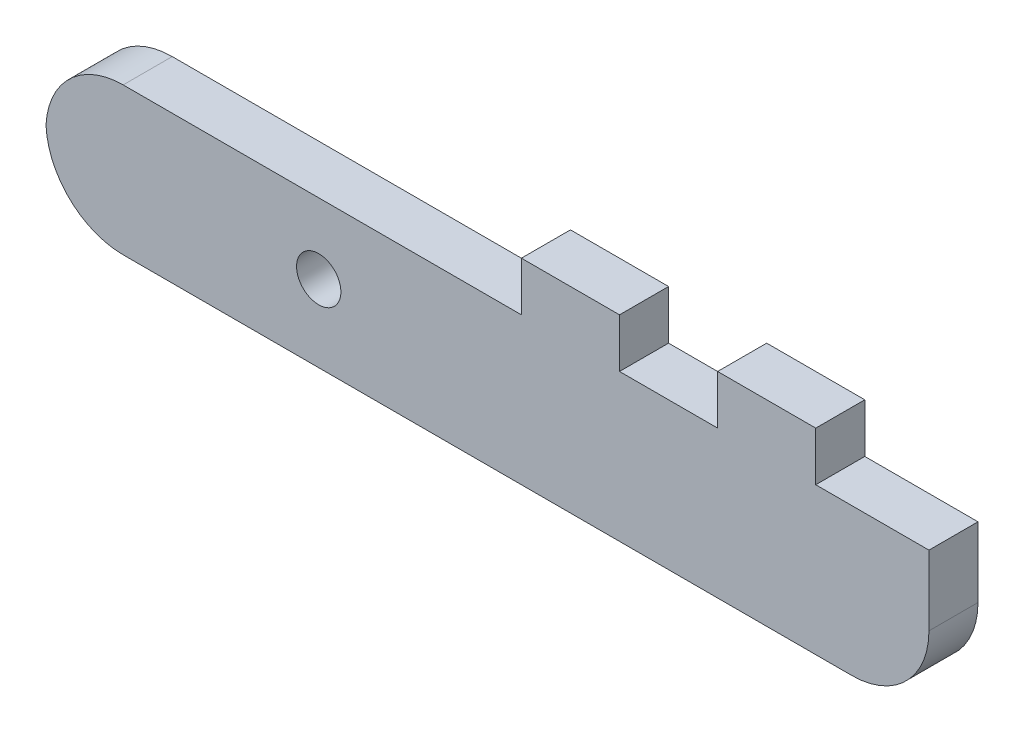
ISO-10303-21;
HEADER;
FILE_DESCRIPTION(('STEP AP214'),'2;1');
FILE_NAME('part.step','',(''),(''),'','','');
FILE_SCHEMA(('AUTOMOTIVE_DESIGN { 1 0 10303 214 1 1 1 1 }'));
ENDSEC;
DATA;
#1=APPLICATION_CONTEXT('core data for automotive mechanical design processes');
#2=APPLICATION_PROTOCOL_DEFINITION('international standard','automotive_design',2000,#1);
#3=PRODUCT_CONTEXT('',#1,'mechanical');
#4=PRODUCT('Part','Part','',(#3));
#5=PRODUCT_RELATED_PRODUCT_CATEGORY('part','',(#4));
#6=PRODUCT_DEFINITION_FORMATION('','',#4);
#7=PRODUCT_DEFINITION_CONTEXT('part definition',#1,'design');
#8=PRODUCT_DEFINITION('design','',#6,#7);
#9=PRODUCT_DEFINITION_SHAPE('','',#8);
#10=(LENGTH_UNIT() NAMED_UNIT(*) SI_UNIT(.MILLI.,.METRE.));
#11=(NAMED_UNIT(*) PLANE_ANGLE_UNIT() SI_UNIT($,.RADIAN.));
#12=(NAMED_UNIT(*) SI_UNIT($,.STERADIAN.) SOLID_ANGLE_UNIT());
#13=UNCERTAINTY_MEASURE_WITH_UNIT(LENGTH_MEASURE(1.E-05),#10,'distance_accuracy_value','');
#14=(GEOMETRIC_REPRESENTATION_CONTEXT(3) GLOBAL_UNCERTAINTY_ASSIGNED_CONTEXT((#13)) GLOBAL_UNIT_ASSIGNED_CONTEXT((#10,
#11,#12)) REPRESENTATION_CONTEXT('',''));
#15=CARTESIAN_POINT('',(0.,0.,0.));
#16=DIRECTION('',(0.,0.,1.));
#17=DIRECTION('',(1.,0.,0.));
#18=AXIS2_PLACEMENT_3D('',#15,#16,#17);
#19=CARTESIAN_POINT('',(26.2355652314434,15.4750000000003,6.35));
#20=DIRECTION('',(1.,0.,0.));
#21=DIRECTION('',(0.,0.,-1.));
#22=AXIS2_PLACEMENT_3D('',#19,#20,#21);
#23=PLANE('',#22);
#24=DIRECTION('',(0.,-1.,0.));
#25=VECTOR('',#24,1.);
#26=CARTESIAN_POINT('',(26.2355652314434,15.4750000000003,0.));
#27=LINE('',#26,#25);
#28=CARTESIAN_POINT('',(26.2355652314434,15.4750000000003,0.));
#29=VERTEX_POINT('',#28);
#30=CARTESIAN_POINT('',(26.2355652314434,9.12500000000056,0.));
#31=VERTEX_POINT('',#30);
#32=EDGE_CURVE('E154',#29,#31,#27,.T.);
#33=ORIENTED_EDGE('',*,*,#32,.T.);
#34=DIRECTION('',(0.,0.,-1.));
#35=VECTOR('',#34,1.);
#36=CARTESIAN_POINT('',(26.2355652314434,9.12500000000056,6.35));
#37=LINE('',#36,#35);
#38=CARTESIAN_POINT('',(26.2355652314434,9.12500000000056,6.35));
#39=VERTEX_POINT('',#38);
#40=EDGE_CURVE('E138',#39,#31,#37,.T.);
#41=ORIENTED_EDGE('',*,*,#40,.F.);
#42=DIRECTION('',(0.,-1.,0.));
#43=VECTOR('',#42,1.);
#44=CARTESIAN_POINT('',(26.2355652314434,15.4750000000003,6.35));
#45=LINE('',#44,#43);
#46=CARTESIAN_POINT('',(26.2355652314434,15.4750000000003,6.35));
#47=VERTEX_POINT('',#46);
#48=EDGE_CURVE('E141',#47,#39,#45,.T.);
#49=ORIENTED_EDGE('',*,*,#48,.F.);
#50=DIRECTION('',(0.,0.,-1.));
#51=VECTOR('',#50,1.);
#52=CARTESIAN_POINT('',(26.2355652314434,15.4750000000003,6.35));
#53=LINE('',#52,#51);
#54=EDGE_CURVE('E223',#47,#29,#53,.T.);
#55=ORIENTED_EDGE('',*,*,#54,.T.);
#56=EDGE_LOOP('',(#33,#41,#49,#55));
#57=FACE_BOUND('',#56,.T.);
#58=ADVANCED_FACE('F33',(#57),#23,.F.);
#59=CARTESIAN_POINT('',(26.2355652314434,9.12500000000056,6.35));
#60=DIRECTION('',(0.,-1.,0.));
#61=DIRECTION('',(1.,0.,0.));
#62=AXIS2_PLACEMENT_3D('',#59,#60,#61);
#63=PLANE('',#62);
#64=DIRECTION('',(-1.,0.,0.));
#65=VECTOR('',#64,1.);
#66=CARTESIAN_POINT('',(26.2355652314434,9.12500000000056,0.));
#67=LINE('',#66,#65);
#68=CARTESIAN_POINT('',(-25.3117995578949,9.12500000000092,0.));
#69=VERTEX_POINT('',#68);
#70=EDGE_CURVE('E204',#31,#69,#67,.T.);
#71=ORIENTED_EDGE('',*,*,#70,.T.);
#72=DIRECTION('',(0.,0.,-1.));
#73=VECTOR('',#72,1.);
#74=CARTESIAN_POINT('',(-25.3117995578949,9.12500000000092,6.35));
#75=LINE('',#74,#73);
#76=CARTESIAN_POINT('',(-25.3117995578949,9.12500000000092,6.35));
#77=VERTEX_POINT('',#76);
#78=EDGE_CURVE('E11',#69,#77,#75,.F.);
#79=ORIENTED_EDGE('',*,*,#78,.T.);
#80=DIRECTION('',(-1.,0.,0.));
#81=VECTOR('',#80,1.);
#82=CARTESIAN_POINT('',(26.2355652314434,9.12500000000056,6.35));
#83=LINE('',#82,#81);
#84=EDGE_CURVE('E133',#39,#77,#83,.T.);
#85=ORIENTED_EDGE('',*,*,#84,.F.);
#86=ORIENTED_EDGE('',*,*,#40,.T.);
#87=EDGE_LOOP('',(#71,#79,#85,#86));
#88=FACE_BOUND('',#87,.T.);
#89=ADVANCED_FACE('F136',(#88),#63,.F.);
#90=CARTESIAN_POINT('',(78.988200442105,-9.92499999999984,6.35));
#91=DIRECTION('',(0.,1.,0.));
#92=DIRECTION('',(-1.,0.,0.));
#93=AXIS2_PLACEMENT_3D('',#90,#91,#92);
#94=PLANE('',#93);
#95=DIRECTION('',(1.,0.,0.));
#96=VECTOR('',#95,1.);
#97=CARTESIAN_POINT('',(78.988200442105,-9.92499999999984,0.));
#98=LINE('',#97,#96);
#99=CARTESIAN_POINT('',(-25.311799557895,-9.92499999999985,0.));
#100=VERTEX_POINT('',#99);
#101=CARTESIAN_POINT('',(68.988200442105,-9.92499999999984,0.));
#102=VERTEX_POINT('',#101);
#103=EDGE_CURVE('E197',#100,#102,#98,.T.);
#104=ORIENTED_EDGE('',*,*,#103,.T.);
#105=DIRECTION('',(0.,0.,-1.));
#106=VECTOR('',#105,1.);
#107=CARTESIAN_POINT('',(68.988200442105,-9.92499999999984,6.35));
#108=LINE('',#107,#106);
#109=CARTESIAN_POINT('',(68.988200442105,-9.92499999999984,6.35));
#110=VERTEX_POINT('',#109);
#111=EDGE_CURVE('E173',#102,#110,#108,.F.);
#112=ORIENTED_EDGE('',*,*,#111,.T.);
#113=DIRECTION('',(1.,0.,0.));
#114=VECTOR('',#113,1.);
#115=CARTESIAN_POINT('',(78.988200442105,-9.92499999999984,6.35));
#116=LINE('',#115,#114);
#117=CARTESIAN_POINT('',(-25.311799557895,-9.92499999999985,6.35));
#118=VERTEX_POINT('',#117);
#119=EDGE_CURVE('E140',#118,#110,#116,.T.);
#120=ORIENTED_EDGE('',*,*,#119,.F.);
#121=DIRECTION('',(0.,0.,-1.));
#122=VECTOR('',#121,1.);
#123=CARTESIAN_POINT('',(-25.311799557895,-9.92499999999985,6.35));
#124=LINE('',#123,#122);
#125=EDGE_CURVE('E171',#118,#100,#124,.T.);
#126=ORIENTED_EDGE('',*,*,#125,.T.);
#127=EDGE_LOOP('',(#104,#112,#120,#126));
#128=FACE_BOUND('',#127,.T.);
#129=ADVANCED_FACE('F202',(#128),#94,.F.);
#130=CARTESIAN_POINT('',(78.988200442105,9.12500000000016,6.35));
#131=DIRECTION('',(-1.,0.,0.));
#132=DIRECTION('',(0.,0.,1.));
#133=AXIS2_PLACEMENT_3D('',#130,#131,#132);
#134=PLANE('',#133);
#135=DIRECTION('',(0.,1.,0.));
#136=VECTOR('',#135,1.);
#137=CARTESIAN_POINT('',(78.988200442105,9.12500000000016,6.35));
#138=LINE('',#137,#136);
#139=CARTESIAN_POINT('',(78.988200442105,0.0750000000001617,6.35));
#140=VERTEX_POINT('',#139);
#141=CARTESIAN_POINT('',(78.988200442105,9.12500000000016,6.35));
#142=VERTEX_POINT('',#141);
#143=EDGE_CURVE('E180',#140,#142,#138,.T.);
#144=ORIENTED_EDGE('',*,*,#143,.F.);
#145=DIRECTION('',(0.,0.,-1.));
#146=VECTOR('',#145,1.);
#147=CARTESIAN_POINT('',(78.988200442105,0.0750000000001583,6.35));
#148=LINE('',#147,#146);
#149=CARTESIAN_POINT('',(78.988200442105,0.0750000000001617,0.));
#150=VERTEX_POINT('',#149);
#151=EDGE_CURVE('E155',#140,#150,#148,.T.);
#152=ORIENTED_EDGE('',*,*,#151,.T.);
#153=DIRECTION('',(0.,1.,0.));
#154=VECTOR('',#153,1.);
#155=CARTESIAN_POINT('',(78.988200442105,9.12500000000016,0.));
#156=LINE('',#155,#154);
#157=CARTESIAN_POINT('',(78.988200442105,9.12500000000016,0.));
#158=VERTEX_POINT('',#157);
#159=EDGE_CURVE('E200',#150,#158,#156,.T.);
#160=ORIENTED_EDGE('',*,*,#159,.T.);
#161=DIRECTION('',(0.,0.,-1.));
#162=VECTOR('',#161,1.);
#163=CARTESIAN_POINT('',(78.988200442105,9.12500000000016,6.35));
#164=LINE('',#163,#162);
#165=EDGE_CURVE('E156',#142,#158,#164,.T.);
#166=ORIENTED_EDGE('',*,*,#165,.F.);
#167=EDGE_LOOP('',(#144,#152,#160,#166));
#168=FACE_BOUND('',#167,.T.);
#169=ADVANCED_FACE('F187',(#168),#134,.F.);
#170=CARTESIAN_POINT('',(78.988200442105,9.12500000000016,6.35));
#171=DIRECTION('',(0.,-1.,0.));
#172=DIRECTION('',(1.,0.,0.));
#173=AXIS2_PLACEMENT_3D('',#170,#171,#172);
#174=PLANE('',#173);
#175=DIRECTION('',(-1.,0.,0.));
#176=VECTOR('',#175,1.);
#177=CARTESIAN_POINT('',(78.988200442105,9.12500000000016,0.));
#178=LINE('',#177,#176);
#179=CARTESIAN_POINT('',(64.3355652314435,9.12500000000091,0.));
#180=VERTEX_POINT('',#179);
#181=EDGE_CURVE('E206',#158,#180,#178,.T.);
#182=ORIENTED_EDGE('',*,*,#181,.T.);
#183=DIRECTION('',(0.,0.,-1.));
#184=VECTOR('',#183,1.);
#185=CARTESIAN_POINT('',(64.3355652314435,9.12500000000091,6.35));
#186=LINE('',#185,#184);
#187=CARTESIAN_POINT('',(64.3355652314435,9.12500000000091,6.35));
#188=VERTEX_POINT('',#187);
#189=EDGE_CURVE('E162',#188,#180,#186,.T.);
#190=ORIENTED_EDGE('',*,*,#189,.F.);
#191=DIRECTION('',(-1.,0.,0.));
#192=VECTOR('',#191,1.);
#193=CARTESIAN_POINT('',(78.988200442105,9.12500000000016,6.35));
#194=LINE('',#193,#192);
#195=EDGE_CURVE('E190',#142,#188,#194,.T.);
#196=ORIENTED_EDGE('',*,*,#195,.F.);
#197=ORIENTED_EDGE('',*,*,#165,.T.);
#198=EDGE_LOOP('',(#182,#190,#196,#197));
#199=FACE_BOUND('',#198,.T.);
#200=ADVANCED_FACE('F282',(#199),#174,.F.);
#201=CARTESIAN_POINT('',(64.3355652314435,15.4750000000007,6.35));
#202=DIRECTION('',(-1.,0.,0.));
#203=DIRECTION('',(0.,0.,1.));
#204=AXIS2_PLACEMENT_3D('',#201,#202,#203);
#205=PLANE('',#204);
#206=DIRECTION('',(0.,1.,0.));
#207=VECTOR('',#206,1.);
#208=CARTESIAN_POINT('',(64.3355652314435,15.4750000000007,0.));
#209=LINE('',#208,#207);
#210=CARTESIAN_POINT('',(64.3355652314435,15.4750000000007,0.));
#211=VERTEX_POINT('',#210);
#212=EDGE_CURVE('E212',#180,#211,#209,.T.);
#213=ORIENTED_EDGE('',*,*,#212,.T.);
#214=DIRECTION('',(0.,0.,-1.));
#215=VECTOR('',#214,1.);
#216=CARTESIAN_POINT('',(64.3355652314435,15.4750000000007,6.35));
#217=LINE('',#216,#215);
#218=CARTESIAN_POINT('',(64.3355652314435,15.4750000000007,6.35));
#219=VERTEX_POINT('',#218);
#220=EDGE_CURVE('E237',#219,#211,#217,.T.);
#221=ORIENTED_EDGE('',*,*,#220,.F.);
#222=DIRECTION('',(0.,1.,0.));
#223=VECTOR('',#222,1.);
#224=CARTESIAN_POINT('',(64.3355652314435,15.4750000000007,6.35));
#225=LINE('',#224,#223);
#226=EDGE_CURVE('E246',#188,#219,#225,.T.);
#227=ORIENTED_EDGE('',*,*,#226,.F.);
#228=ORIENTED_EDGE('',*,*,#189,.T.);
#229=EDGE_LOOP('',(#213,#221,#227,#228));
#230=FACE_BOUND('',#229,.T.);
#231=ADVANCED_FACE('F244',(#230),#205,.F.);
#232=CARTESIAN_POINT('',(51.6355652314434,15.4750000000007,6.35));
#233=DIRECTION('',(0.,-1.,0.));
#234=DIRECTION('',(0.,0.,-1.));
#235=AXIS2_PLACEMENT_3D('',#232,#233,#234);
#236=PLANE('',#235);
#237=DIRECTION('',(-1.,0.,0.));
#238=VECTOR('',#237,1.);
#239=CARTESIAN_POINT('',(51.6355652314434,15.4750000000007,0.));
#240=LINE('',#239,#238);
#241=CARTESIAN_POINT('',(51.6355652314434,15.4750000000007,0.));
#242=VERTEX_POINT('',#241);
#243=EDGE_CURVE('E214',#211,#242,#240,.T.);
#244=ORIENTED_EDGE('',*,*,#243,.T.);
#245=DIRECTION('',(0.,0.,-1.));
#246=VECTOR('',#245,1.);
#247=CARTESIAN_POINT('',(51.6355652314434,15.4750000000007,6.35));
#248=LINE('',#247,#246);
#249=CARTESIAN_POINT('',(51.6355652314434,15.4750000000007,6.35));
#250=VERTEX_POINT('',#249);
#251=EDGE_CURVE('E234',#250,#242,#248,.T.);
#252=ORIENTED_EDGE('',*,*,#251,.F.);
#253=DIRECTION('',(-1.,0.,0.));
#254=VECTOR('',#253,1.);
#255=CARTESIAN_POINT('',(51.6355652314434,15.4750000000007,6.35));
#256=LINE('',#255,#254);
#257=EDGE_CURVE('E262',#219,#250,#256,.T.);
#258=ORIENTED_EDGE('',*,*,#257,.F.);
#259=ORIENTED_EDGE('',*,*,#220,.T.);
#260=EDGE_LOOP('',(#244,#252,#258,#259));
#261=FACE_BOUND('',#260,.T.);
#262=ADVANCED_FACE('F253',(#261),#236,.F.);
#263=CARTESIAN_POINT('',(51.6355652314434,15.4750000000007,6.35));
#264=DIRECTION('',(1.,0.,0.));
#265=DIRECTION('',(0.,0.,-1.));
#266=AXIS2_PLACEMENT_3D('',#263,#264,#265);
#267=PLANE('',#266);
#268=DIRECTION('',(0.,-1.,0.));
#269=VECTOR('',#268,1.);
#270=CARTESIAN_POINT('',(51.6355652314434,15.4750000000007,0.));
#271=LINE('',#270,#269);
#272=CARTESIAN_POINT('',(51.6355652314434,9.12500000000016,0.));
#273=VERTEX_POINT('',#272);
#274=EDGE_CURVE('E216',#242,#273,#271,.T.);
#275=ORIENTED_EDGE('',*,*,#274,.T.);
#276=DIRECTION('',(0.,0.,-1.));
#277=VECTOR('',#276,1.);
#278=CARTESIAN_POINT('',(51.6355652314434,9.12500000000016,6.35));
#279=LINE('',#278,#277);
#280=CARTESIAN_POINT('',(51.6355652314434,9.12500000000016,6.35));
#281=VERTEX_POINT('',#280);
#282=EDGE_CURVE('E231',#281,#273,#279,.T.);
#283=ORIENTED_EDGE('',*,*,#282,.F.);
#284=DIRECTION('',(0.,-1.,0.));
#285=VECTOR('',#284,1.);
#286=CARTESIAN_POINT('',(51.6355652314434,15.4750000000007,6.35));
#287=LINE('',#286,#285);
#288=EDGE_CURVE('E259',#250,#281,#287,.T.);
#289=ORIENTED_EDGE('',*,*,#288,.F.);
#290=ORIENTED_EDGE('',*,*,#251,.T.);
#291=EDGE_LOOP('',(#275,#283,#289,#290));
#292=FACE_BOUND('',#291,.T.);
#293=ADVANCED_FACE('F257',(#292),#267,.F.);
#294=CARTESIAN_POINT('',(51.6355652314434,9.12500000000016,6.35));
#295=DIRECTION('',(0.,-1.,0.));
#296=DIRECTION('',(1.,0.,0.));
#297=AXIS2_PLACEMENT_3D('',#294,#295,#296);
#298=PLANE('',#297);
#299=DIRECTION('',(-1.,0.,0.));
#300=VECTOR('',#299,1.);
#301=CARTESIAN_POINT('',(51.6355652314434,9.12500000000016,0.));
#302=LINE('',#301,#300);
#303=CARTESIAN_POINT('',(38.9355652314435,9.12500000000056,0.));
#304=VERTEX_POINT('',#303);
#305=EDGE_CURVE('E218',#273,#304,#302,.T.);
#306=ORIENTED_EDGE('',*,*,#305,.T.);
#307=DIRECTION('',(0.,0.,-1.));
#308=VECTOR('',#307,1.);
#309=CARTESIAN_POINT('',(38.9355652314435,9.12500000000056,6.35));
#310=LINE('',#309,#308);
#311=CARTESIAN_POINT('',(38.9355652314435,9.12500000000056,6.35));
#312=VERTEX_POINT('',#311);
#313=EDGE_CURVE('E228',#312,#304,#310,.T.);
#314=ORIENTED_EDGE('',*,*,#313,.F.);
#315=DIRECTION('',(-1.,0.,0.));
#316=VECTOR('',#315,1.);
#317=CARTESIAN_POINT('',(51.6355652314434,9.12500000000016,6.35));
#318=LINE('',#317,#316);
#319=EDGE_CURVE('E261',#281,#312,#318,.T.);
#320=ORIENTED_EDGE('',*,*,#319,.F.);
#321=ORIENTED_EDGE('',*,*,#282,.T.);
#322=EDGE_LOOP('',(#306,#314,#320,#321));
#323=FACE_BOUND('',#322,.T.);
#324=ADVANCED_FACE('F322',(#323),#298,.F.);
#325=CARTESIAN_POINT('',(38.9355652314435,15.4750000000003,6.35));
#326=DIRECTION('',(-1.,0.,0.));
#327=DIRECTION('',(0.,0.,1.));
#328=AXIS2_PLACEMENT_3D('',#325,#326,#327);
#329=PLANE('',#328);
#330=DIRECTION('',(0.,1.,0.));
#331=VECTOR('',#330,1.);
#332=CARTESIAN_POINT('',(38.9355652314435,15.4750000000003,0.));
#333=LINE('',#332,#331);
#334=CARTESIAN_POINT('',(38.9355652314435,15.4750000000003,0.));
#335=VERTEX_POINT('',#334);
#336=EDGE_CURVE('E220',#304,#335,#333,.T.);
#337=ORIENTED_EDGE('',*,*,#336,.T.);
#338=DIRECTION('',(0.,0.,-1.));
#339=VECTOR('',#338,1.);
#340=CARTESIAN_POINT('',(38.9355652314435,15.4750000000003,6.35));
#341=LINE('',#340,#339);
#342=CARTESIAN_POINT('',(38.9355652314435,15.4750000000003,6.35));
#343=VERTEX_POINT('',#342);
#344=EDGE_CURVE('E225',#343,#335,#341,.T.);
#345=ORIENTED_EDGE('',*,*,#344,.F.);
#346=DIRECTION('',(0.,1.,0.));
#347=VECTOR('',#346,1.);
#348=CARTESIAN_POINT('',(38.9355652314435,15.4750000000003,6.35));
#349=LINE('',#348,#347);
#350=EDGE_CURVE('E264',#312,#343,#349,.T.);
#351=ORIENTED_EDGE('',*,*,#350,.F.);
#352=ORIENTED_EDGE('',*,*,#313,.T.);
#353=EDGE_LOOP('',(#337,#345,#351,#352));
#354=FACE_BOUND('',#353,.T.);
#355=ADVANCED_FACE('F319',(#354),#329,.F.);
#356=CARTESIAN_POINT('',(26.2355652314434,15.4750000000003,6.35));
#357=DIRECTION('',(0.,-1.,0.));
#358=DIRECTION('',(0.,0.,-1.));
#359=AXIS2_PLACEMENT_3D('',#356,#357,#358);
#360=PLANE('',#359);
#361=DIRECTION('',(-1.,0.,0.));
#362=VECTOR('',#361,1.);
#363=CARTESIAN_POINT('',(26.2355652314434,15.4750000000003,0.));
#364=LINE('',#363,#362);
#365=EDGE_CURVE('E151',#335,#29,#364,.T.);
#366=ORIENTED_EDGE('',*,*,#365,.T.);
#367=ORIENTED_EDGE('',*,*,#54,.F.);
#368=DIRECTION('',(-1.,0.,0.));
#369=VECTOR('',#368,1.);
#370=CARTESIAN_POINT('',(26.2355652314434,15.4750000000003,6.35));
#371=LINE('',#370,#369);
#372=EDGE_CURVE('E147',#343,#47,#371,.T.);
#373=ORIENTED_EDGE('',*,*,#372,.F.);
#374=ORIENTED_EDGE('',*,*,#344,.T.);
#375=EDGE_LOOP('',(#366,#367,#373,#374));
#376=FACE_BOUND('',#375,.T.);
#377=ADVANCED_FACE('F315',(#376),#360,.F.);
#378=CARTESIAN_POINT('',(0.,0.,6.35));
#379=DIRECTION('',(0.,0.,-1.));
#380=DIRECTION('',(-1.,0.,0.));
#381=AXIS2_PLACEMENT_3D('',#378,#379,#380);
#382=PLANE('',#381);
#383=CARTESIAN_POINT('',(0.,0.,6.35));
#384=DIRECTION('',(0.,0.,1.));
#385=DIRECTION('',(1.,0.,0.));
#386=AXIS2_PLACEMENT_3D('',#383,#384,#385);
#387=CIRCLE('',#386,2.87019999999999);
#388=CARTESIAN_POINT('',(2.87019999999999,0.,6.35));
#389=VERTEX_POINT('',#388);
#390=EDGE_CURVE('E274',#389,#389,#387,.T.);
#391=ORIENTED_EDGE('',*,*,#390,.F.);
#392=EDGE_LOOP('',(#391));
#393=FACE_BOUND('',#392,.T.);
#394=ORIENTED_EDGE('',*,*,#119,.T.);
#395=CARTESIAN_POINT('',(68.988200442105,0.0750000000001583,6.35));
#396=DIRECTION('',(0.,0.,-1.));
#397=DIRECTION('',(-1.,0.,0.));
#398=AXIS2_PLACEMENT_3D('',#395,#396,#397);
#399=CIRCLE('',#398,10.);
#400=EDGE_CURVE('E42',#110,#140,#399,.F.);
#401=ORIENTED_EDGE('',*,*,#400,.T.);
#402=ORIENTED_EDGE('',*,*,#143,.T.);
#403=ORIENTED_EDGE('',*,*,#195,.T.);
#404=ORIENTED_EDGE('',*,*,#226,.T.);
#405=ORIENTED_EDGE('',*,*,#257,.T.);
#406=ORIENTED_EDGE('',*,*,#288,.T.);
#407=ORIENTED_EDGE('',*,*,#319,.T.);
#408=ORIENTED_EDGE('',*,*,#350,.T.);
#409=ORIENTED_EDGE('',*,*,#372,.T.);
#410=ORIENTED_EDGE('',*,*,#48,.T.);
#411=ORIENTED_EDGE('',*,*,#84,.T.);
#412=CARTESIAN_POINT('',(-25.311799557895,-0.874999999999083,6.35));
#413=DIRECTION('',(0.,0.,-1.));
#414=DIRECTION('',(-1.,0.,0.));
#415=AXIS2_PLACEMENT_3D('',#412,#413,#414);
#416=CIRCLE('',#415,10.);
#417=CARTESIAN_POINT('',(-35.3005119373762,-0.399999999999541,6.35));
#418=VERTEX_POINT('',#417);
#419=EDGE_CURVE('E49',#77,#418,#416,.F.);
#420=ORIENTED_EDGE('',*,*,#419,.T.);
#421=CARTESIAN_POINT('',(-25.311799557895,0.0750000000001474,6.35));
#422=DIRECTION('',(0.,0.,-1.));
#423=DIRECTION('',(-1.,0.,0.));
#424=AXIS2_PLACEMENT_3D('',#421,#422,#423);
#425=CIRCLE('',#424,10.);
#426=EDGE_CURVE('E175',#418,#118,#425,.F.);
#427=ORIENTED_EDGE('',*,*,#426,.T.);
#428=EDGE_LOOP('',(#394,#401,#402,#403,#404,#405,#406,#407,#408,#409,#410,#411,#420,#427));
#429=FACE_BOUND('',#428,.T.);
#430=ADVANCED_FACE('F145',(#393,#429),#382,.F.);
#431=CARTESIAN_POINT('',(0.,0.,0.));
#432=DIRECTION('',(0.,0.,-1.));
#433=DIRECTION('',(-1.,0.,0.));
#434=AXIS2_PLACEMENT_3D('',#431,#432,#433);
#435=PLANE('',#434);
#436=CARTESIAN_POINT('',(0.,0.,0.));
#437=DIRECTION('',(0.,0.,1.));
#438=DIRECTION('',(1.,0.,0.));
#439=AXIS2_PLACEMENT_3D('',#436,#437,#438);
#440=CIRCLE('',#439,2.87019999999999);
#441=CARTESIAN_POINT('',(2.87019999999999,0.,0.));
#442=VERTEX_POINT('',#441);
#443=EDGE_CURVE('E270',#442,#442,#440,.T.);
#444=ORIENTED_EDGE('',*,*,#443,.T.);
#445=EDGE_LOOP('',(#444));
#446=FACE_BOUND('',#445,.T.);
#447=ORIENTED_EDGE('',*,*,#159,.F.);
#448=CARTESIAN_POINT('',(68.988200442105,0.0750000000001583,0.));
#449=DIRECTION('',(0.,0.,-1.));
#450=DIRECTION('',(-1.,0.,0.));
#451=AXIS2_PLACEMENT_3D('',#448,#449,#450);
#452=CIRCLE('',#451,10.);
#453=EDGE_CURVE('E169',#150,#102,#452,.T.);
#454=ORIENTED_EDGE('',*,*,#453,.T.);
#455=ORIENTED_EDGE('',*,*,#103,.F.);
#456=CARTESIAN_POINT('',(-25.311799557895,0.0750000000001474,0.));
#457=DIRECTION('',(0.,0.,-1.));
#458=DIRECTION('',(-1.,0.,0.));
#459=AXIS2_PLACEMENT_3D('',#456,#457,#458);
#460=CIRCLE('',#459,10.);
#461=CARTESIAN_POINT('',(-35.3005119373762,-0.399999999999541,0.));
#462=VERTEX_POINT('',#461);
#463=EDGE_CURVE('E159',#100,#462,#460,.T.);
#464=ORIENTED_EDGE('',*,*,#463,.T.);
#465=CARTESIAN_POINT('',(-25.311799557895,-0.874999999999083,0.));
#466=DIRECTION('',(0.,0.,-1.));
#467=DIRECTION('',(-1.,0.,0.));
#468=AXIS2_PLACEMENT_3D('',#465,#466,#467);
#469=CIRCLE('',#468,10.);
#470=EDGE_CURVE('E167',#462,#69,#469,.T.);
#471=ORIENTED_EDGE('',*,*,#470,.T.);
#472=ORIENTED_EDGE('',*,*,#70,.F.);
#473=ORIENTED_EDGE('',*,*,#32,.F.);
#474=ORIENTED_EDGE('',*,*,#365,.F.);
#475=ORIENTED_EDGE('',*,*,#336,.F.);
#476=ORIENTED_EDGE('',*,*,#305,.F.);
#477=ORIENTED_EDGE('',*,*,#274,.F.);
#478=ORIENTED_EDGE('',*,*,#243,.F.);
#479=ORIENTED_EDGE('',*,*,#212,.F.);
#480=ORIENTED_EDGE('',*,*,#181,.F.);
#481=EDGE_LOOP('',(#447,#454,#455,#464,#471,#472,#473,#474,#475,#476,#477,#478,#479,#480));
#482=FACE_BOUND('',#481,.T.);
#483=ADVANCED_FACE('F196',(#446,#482),#435,.T.);
#484=CARTESIAN_POINT('',(68.988200442105,0.0750000000001583,6.35));
#485=DIRECTION('',(0.,0.,-1.));
#486=DIRECTION('',(-1.,0.,0.));
#487=AXIS2_PLACEMENT_3D('',#484,#485,#486);
#488=CYLINDRICAL_SURFACE('',#487,10.);
#489=ORIENTED_EDGE('',*,*,#400,.F.);
#490=ORIENTED_EDGE('',*,*,#111,.F.);
#491=ORIENTED_EDGE('',*,*,#453,.F.);
#492=ORIENTED_EDGE('',*,*,#151,.F.);
#493=EDGE_LOOP('',(#489,#490,#491,#492));
#494=FACE_BOUND('',#493,.T.);
#495=ADVANCED_FACE('F192',(#494),#488,.T.);
#496=CARTESIAN_POINT('',(-25.311799557895,0.0750000000001474,6.35));
#497=DIRECTION('',(0.,0.,-1.));
#498=DIRECTION('',(-1.,0.,0.));
#499=AXIS2_PLACEMENT_3D('',#496,#497,#498);
#500=CYLINDRICAL_SURFACE('',#499,10.);
#501=ORIENTED_EDGE('',*,*,#125,.F.);
#502=ORIENTED_EDGE('',*,*,#426,.F.);
#503=DIRECTION('',(0.,0.,-1.));
#504=VECTOR('',#503,1.);
#505=CARTESIAN_POINT('',(-35.3005119373762,-0.399999999999541,3.175));
#506=LINE('',#505,#504);
#507=EDGE_CURVE('E37',#462,#418,#506,.F.);
#508=ORIENTED_EDGE('',*,*,#507,.F.);
#509=ORIENTED_EDGE('',*,*,#463,.F.);
#510=EDGE_LOOP('',(#501,#502,#508,#509));
#511=FACE_BOUND('',#510,.T.);
#512=ADVANCED_FACE('F35',(#511),#500,.T.);
#513=CARTESIAN_POINT('',(-25.311799557895,-0.874999999999083,6.35));
#514=DIRECTION('',(0.,0.,-1.));
#515=DIRECTION('',(-1.,0.,0.));
#516=AXIS2_PLACEMENT_3D('',#513,#514,#515);
#517=CYLINDRICAL_SURFACE('',#516,10.);
#518=ORIENTED_EDGE('',*,*,#419,.F.);
#519=ORIENTED_EDGE('',*,*,#78,.F.);
#520=ORIENTED_EDGE('',*,*,#470,.F.);
#521=ORIENTED_EDGE('',*,*,#507,.T.);
#522=EDGE_LOOP('',(#518,#519,#520,#521));
#523=FACE_BOUND('',#522,.T.);
#524=ADVANCED_FACE('F300',(#523),#517,.T.);
#525=CARTESIAN_POINT('',(0.,0.,0.));
#526=DIRECTION('',(0.,0.,1.));
#527=DIRECTION('',(1.,0.,0.));
#528=AXIS2_PLACEMENT_3D('',#525,#526,#527);
#529=CYLINDRICAL_SURFACE('',#528,2.87019999999999);
#530=ORIENTED_EDGE('',*,*,#443,.F.);
#531=EDGE_LOOP('',(#530));
#532=FACE_BOUND('',#531,.T.);
#533=ORIENTED_EDGE('',*,*,#390,.T.);
#534=EDGE_LOOP('',(#533));
#535=FACE_BOUND('',#534,.T.);
#536=ADVANCED_FACE('F302',(#532,#535),#529,.F.);
#537=CLOSED_SHELL('',(#58,#89,#129,#169,#200,#231,#262,#293,#324,#355,#377,#430,#483,#495,#512,
#524,#536));
#538=MANIFOLD_SOLID_BREP('B2',#537);
#539=ADVANCED_BREP_SHAPE_REPRESENTATION('',(#18,#538),#14);
#540=SHAPE_DEFINITION_REPRESENTATION(#9,#539);
ENDSEC;
END-ISO-10303-21;
